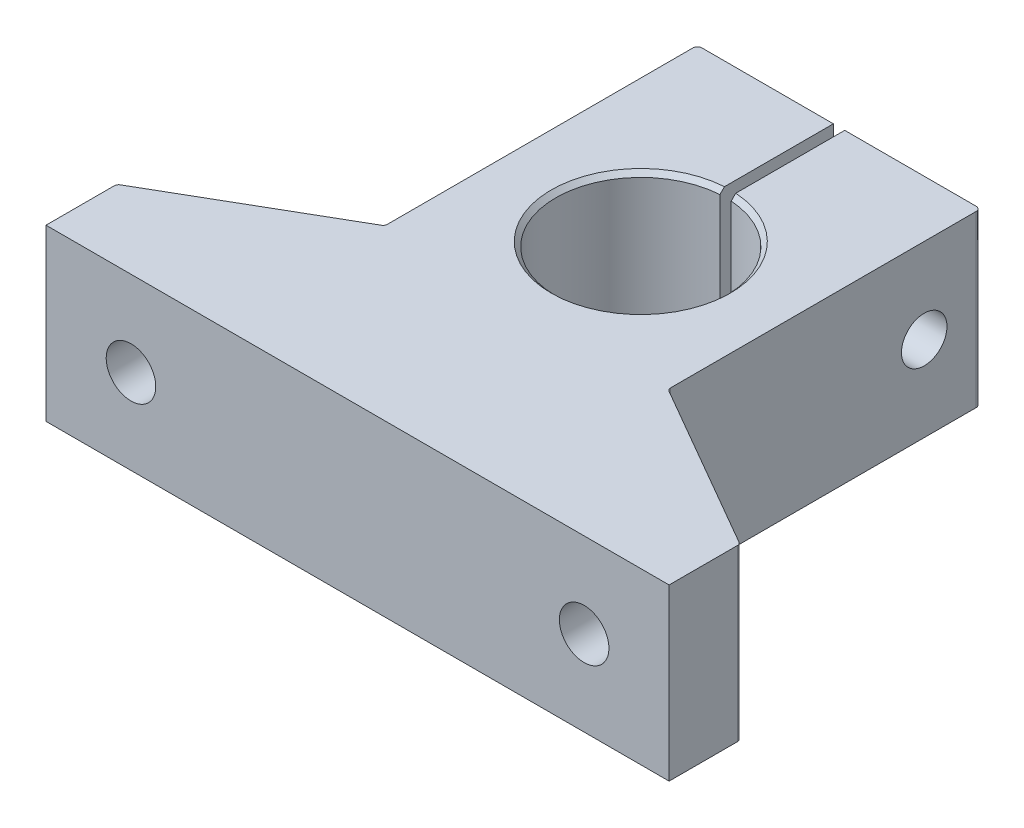
ISO-10303-21;
HEADER;
FILE_DESCRIPTION(('STEP AP214'),'2;1');
FILE_NAME('part.step','',(''),(''),'','','');
FILE_SCHEMA(('AUTOMOTIVE_DESIGN { 1 0 10303 214 1 1 1 1 }'));
ENDSEC;
DATA;
#1=APPLICATION_CONTEXT('core data for automotive mechanical design processes');
#2=APPLICATION_PROTOCOL_DEFINITION('international standard','automotive_design',2000,#1);
#3=PRODUCT_CONTEXT('',#1,'mechanical');
#4=PRODUCT('Part','Part','',(#3));
#5=PRODUCT_RELATED_PRODUCT_CATEGORY('part','',(#4));
#6=PRODUCT_DEFINITION_FORMATION('','',#4);
#7=PRODUCT_DEFINITION_CONTEXT('part definition',#1,'design');
#8=PRODUCT_DEFINITION('design','',#6,#7);
#9=PRODUCT_DEFINITION_SHAPE('','',#8);
#10=(LENGTH_UNIT() NAMED_UNIT(*) SI_UNIT(.MILLI.,.METRE.));
#11=(NAMED_UNIT(*) PLANE_ANGLE_UNIT() SI_UNIT($,.RADIAN.));
#12=(NAMED_UNIT(*) SI_UNIT($,.STERADIAN.) SOLID_ANGLE_UNIT());
#13=UNCERTAINTY_MEASURE_WITH_UNIT(LENGTH_MEASURE(1.E-05),#10,'distance_accuracy_value','');
#14=(GEOMETRIC_REPRESENTATION_CONTEXT(3) GLOBAL_UNCERTAINTY_ASSIGNED_CONTEXT((#13)) GLOBAL_UNIT_ASSIGNED_CONTEXT((#10,
#11,#12)) REPRESENTATION_CONTEXT('',''));
#15=CARTESIAN_POINT('',(0.,0.,0.));
#16=DIRECTION('',(0.,0.,1.));
#17=DIRECTION('',(1.,0.,0.));
#18=AXIS2_PLACEMENT_3D('',#15,#16,#17);
#19=CARTESIAN_POINT('',(34.925,19.05,-7.9375));
#20=DIRECTION('',(0.,0.,-1.));
#21=DIRECTION('',(-1.,0.,0.));
#22=AXIS2_PLACEMENT_3D('',#19,#20,#21);
#23=PLANE('',#22);
#24=CARTESIAN_POINT('',(25.4,9.525,-7.9375));
#25=DIRECTION('',(0.,0.,-1.));
#26=DIRECTION('',(-1.,0.,0.));
#27=AXIS2_PLACEMENT_3D('',#24,#25,#26);
#28=CIRCLE('',#27,4.7625);
#29=CARTESIAN_POINT('',(20.6375,9.525,-7.9375));
#30=VERTEX_POINT('',#29);
#31=EDGE_CURVE('E364',#30,#30,#28,.T.);
#32=ORIENTED_EDGE('',*,*,#31,.T.);
#33=EDGE_LOOP('',(#32));
#34=FACE_BOUND('',#33,.T.);
#35=CARTESIAN_POINT('',(25.4,9.525,-7.9375));
#36=DIRECTION('',(0.,0.,-1.));
#37=DIRECTION('',(-1.,0.,0.));
#38=AXIS2_PLACEMENT_3D('',#35,#36,#37);
#39=CIRCLE('',#38,2.77876);
#40=CARTESIAN_POINT('',(22.62124,9.525,-7.9375));
#41=VERTEX_POINT('',#40);
#42=EDGE_CURVE('E377',#41,#41,#39,.F.);
#43=ORIENTED_EDGE('',*,*,#42,.T.);
#44=EDGE_LOOP('',(#43));
#45=FACE_BOUND('',#44,.T.);
#46=ADVANCED_FACE('F18',(#34,#45),#23,.T.);
#47=CARTESIAN_POINT('',(34.925,19.05,-7.9375));
#48=DIRECTION('',(0.,0.,-1.));
#49=DIRECTION('',(-1.,0.,0.));
#50=AXIS2_PLACEMENT_3D('',#47,#48,#49);
#51=PLANE('',#50);
#52=CARTESIAN_POINT('',(-25.4,9.525,-7.93749999999999));
#53=DIRECTION('',(0.,0.,-1.));
#54=DIRECTION('',(-1.,0.,0.));
#55=AXIS2_PLACEMENT_3D('',#52,#53,#54);
#56=CIRCLE('',#55,4.7625);
#57=CARTESIAN_POINT('',(-30.1625,9.525,-7.93749999999999));
#58=VERTEX_POINT('',#57);
#59=EDGE_CURVE('E381',#58,#58,#56,.T.);
#60=ORIENTED_EDGE('',*,*,#59,.T.);
#61=EDGE_LOOP('',(#60));
#62=FACE_BOUND('',#61,.T.);
#63=CARTESIAN_POINT('',(-25.4,9.525,-7.93749999999999));
#64=DIRECTION('',(0.,0.,-1.));
#65=DIRECTION('',(-1.,0.,0.));
#66=AXIS2_PLACEMENT_3D('',#63,#64,#65);
#67=CIRCLE('',#66,2.77876);
#68=CARTESIAN_POINT('',(-28.17876,9.525,-7.93749999999999));
#69=VERTEX_POINT('',#68);
#70=EDGE_CURVE('E373',#69,#69,#67,.F.);
#71=ORIENTED_EDGE('',*,*,#70,.T.);
#72=EDGE_LOOP('',(#71));
#73=FACE_BOUND('',#72,.T.);
#74=ADVANCED_FACE('F219',(#62,#73),#51,.T.);
#75=CARTESIAN_POINT('',(-11.049,12.0777,-47.6453526164564));
#76=DIRECTION('',(1.,0.,0.));
#77=DIRECTION('',(0.,0.,-1.));
#78=AXIS2_PLACEMENT_3D('',#75,#76,#77);
#79=PLANE('',#78);
#80=CARTESIAN_POINT('',(-11.049,9.525,-47.6453526164564));
#81=DIRECTION('',(-1.,0.,0.));
#82=DIRECTION('',(0.,0.,1.));
#83=AXIS2_PLACEMENT_3D('',#80,#81,#82);
#84=CIRCLE('',#83,4.7625);
#85=CARTESIAN_POINT('',(-11.049,9.525,-42.8828526164564));
#86=VERTEX_POINT('',#85);
#87=EDGE_CURVE('E387',#86,#86,#84,.T.);
#88=ORIENTED_EDGE('',*,*,#87,.T.);
#89=EDGE_LOOP('',(#88));
#90=FACE_BOUND('',#89,.T.);
#91=CARTESIAN_POINT('',(-11.049,9.525,-47.6453526164564));
#92=DIRECTION('',(-1.,0.,0.));
#93=DIRECTION('',(0.,0.,1.));
#94=AXIS2_PLACEMENT_3D('',#91,#92,#93);
#95=CIRCLE('',#94,2.55269999999999);
#96=CARTESIAN_POINT('',(-11.049,9.525,-45.0926526164564));
#97=VERTEX_POINT('',#96);
#98=EDGE_CURVE('E112',#97,#97,#95,.F.);
#99=ORIENTED_EDGE('',*,*,#98,.T.);
#100=EDGE_LOOP('',(#99));
#101=FACE_BOUND('',#100,.T.);
#102=ADVANCED_FACE('F215',(#90,#101),#79,.F.);
#103=CARTESIAN_POINT('',(0.,19.05,-31.75));
#104=DIRECTION('',(0.,1.,0.));
#105=DIRECTION('',(-1.,0.,0.));
#106=AXIS2_PLACEMENT_3D('',#103,#104,#105);
#107=CONICAL_SURFACE('',#106,10.033,0.785398163397435);
#108=CARTESIAN_POINT('',(0.,18.542,-31.75));
#109=DIRECTION('',(0.,1.,0.));
#110=DIRECTION('',(0.,0.,1.));
#111=AXIS2_PLACEMENT_3D('',#108,#109,#110);
#112=CIRCLE('',#111,9.525);
#113=CARTESIAN_POINT('',(0.635000000000001,18.542,-41.2538097624058));
#114=VERTEX_POINT('',#113);
#115=CARTESIAN_POINT('',(-0.635,18.542,-41.2538097624058));
#116=VERTEX_POINT('',#115);
#117=EDGE_CURVE('E101',#114,#116,#112,.F.);
#118=ORIENTED_EDGE('',*,*,#117,.T.);
#119=CARTESIAN_POINT('',(-0.635000000000001,19.05,-41.7628848989689));
#120=CARTESIAN_POINT('',(-0.635,18.9653286642886,-41.6780437020624));
#121=CARTESIAN_POINT('',(-0.635,18.8806596631005,-41.593200175563));
#122=CARTESIAN_POINT('',(-0.635,18.7113263297671,-41.4235084633753));
#123=CARTESIAN_POINT('',(-0.635,18.626661997622,-41.3386602776869));
#124=CARTESIAN_POINT('',(-0.635,18.542,-41.2538097624058));
#125=B_SPLINE_CURVE_WITH_KNOTS('',3,(#119,#120,#121,#122,#123,#124),.UNSPECIFIED.,.F.,.F.,(4,2,
4),(0.,0.359590564057941,0.719181128130027),.UNSPECIFIED.);
#126=CARTESIAN_POINT('',(-0.635000000000001,19.05,-41.7628848989689));
#127=VERTEX_POINT('',#126);
#128=EDGE_CURVE('E21',#127,#116,#125,.T.);
#129=ORIENTED_EDGE('',*,*,#128,.F.);
#130=CARTESIAN_POINT('',(0.,19.05,-31.75));
#131=DIRECTION('',(0.,1.,0.));
#132=DIRECTION('',(-1.,0.,0.));
#133=AXIS2_PLACEMENT_3D('',#130,#131,#132);
#134=CIRCLE('',#133,10.033);
#135=CARTESIAN_POINT('',(0.635,19.05,-41.7628848989689));
#136=VERTEX_POINT('',#135);
#137=EDGE_CURVE('E94',#127,#136,#134,.T.);
#138=ORIENTED_EDGE('',*,*,#137,.T.);
#139=CARTESIAN_POINT('',(0.635000000000001,18.542,-41.2538097624058));
#140=CARTESIAN_POINT('',(0.635,18.626661997622,-41.3386602776869));
#141=CARTESIAN_POINT('',(0.635,18.7113263297671,-41.4235084633753));
#142=CARTESIAN_POINT('',(0.635,18.8806596631005,-41.593200175563));
#143=CARTESIAN_POINT('',(0.635,18.9653286642886,-41.6780437020624));
#144=CARTESIAN_POINT('',(0.635,19.05,-41.7628848989689));
#145=B_SPLINE_CURVE_WITH_KNOTS('',3,(#139,#140,#141,#142,#143,#144),.UNSPECIFIED.,.F.,.F.,(4,2,
4),(0.,0.359590564072086,0.719181128130027),.UNSPECIFIED.);
#146=EDGE_CURVE('E105',#114,#136,#145,.T.);
#147=ORIENTED_EDGE('',*,*,#146,.F.);
#148=EDGE_LOOP('',(#118,#129,#138,#147));
#149=FACE_BOUND('',#148,.T.);
#150=ADVANCED_FACE('F103',(#149),#107,.F.);
#151=CARTESIAN_POINT('',(-15.875,9.525,-47.6453526164564));
#152=DIRECTION('',(-1.,0.,0.));
#153=DIRECTION('',(0.,0.,1.));
#154=AXIS2_PLACEMENT_3D('',#151,#152,#153);
#155=CYLINDRICAL_SURFACE('',#154,2.55269999999999);
#156=CARTESIAN_POINT('',(-0.634999999999995,9.525,-47.6453526164564));
#157=DIRECTION('',(-1.,0.,0.));
#158=DIRECTION('',(0.,0.,1.));
#159=AXIS2_PLACEMENT_3D('',#156,#157,#158);
#160=CIRCLE('',#159,2.55269999999999);
#161=CARTESIAN_POINT('',(-0.634999999999995,9.525,-45.0926526164564));
#162=VERTEX_POINT('',#161);
#163=EDGE_CURVE('E134',#162,#162,#160,.F.);
#164=ORIENTED_EDGE('',*,*,#163,.T.);
#165=EDGE_LOOP('',(#164));
#166=FACE_BOUND('',#165,.T.);
#167=ORIENTED_EDGE('',*,*,#98,.F.);
#168=EDGE_LOOP('',(#167));
#169=FACE_BOUND('',#168,.T.);
#170=ADVANCED_FACE('F214',(#166,#169),#155,.F.);
#171=CARTESIAN_POINT('',(0.,0.,-31.75));
#172=DIRECTION('',(0.,1.,0.));
#173=DIRECTION('',(0.,0.,1.));
#174=AXIS2_PLACEMENT_3D('',#171,#172,#173);
#175=CYLINDRICAL_SURFACE('',#174,9.525);
#176=DIRECTION('',(0.,1.,0.));
#177=VECTOR('',#176,1.);
#178=CARTESIAN_POINT('',(0.635000000000012,0.,-41.2538097624058));
#179=LINE('',#178,#177);
#180=CARTESIAN_POINT('',(0.635000000000012,0.507999999999944,-41.2538097624058));
#181=VERTEX_POINT('',#180);
#182=EDGE_CURVE('E191',#114,#181,#179,.F.);
#183=ORIENTED_EDGE('',*,*,#182,.T.);
#184=CARTESIAN_POINT('',(0.,0.507999999999948,-31.75));
#185=DIRECTION('',(0.,-1.,0.));
#186=DIRECTION('',(0.,0.,-1.));
#187=AXIS2_PLACEMENT_3D('',#184,#185,#186);
#188=CIRCLE('',#187,9.525);
#189=CARTESIAN_POINT('',(-0.634999999999988,0.507999999999947,-41.2538097624058));
#190=VERTEX_POINT('',#189);
#191=EDGE_CURVE('E126',#181,#190,#188,.T.);
#192=ORIENTED_EDGE('',*,*,#191,.T.);
#193=DIRECTION('',(0.,-1.,0.));
#194=VECTOR('',#193,1.);
#195=CARTESIAN_POINT('',(-0.634999999999988,0.,-41.2538097624058));
#196=LINE('',#195,#194);
#197=EDGE_CURVE('E119',#190,#116,#196,.F.);
#198=ORIENTED_EDGE('',*,*,#197,.T.);
#199=ORIENTED_EDGE('',*,*,#117,.F.);
#200=EDGE_LOOP('',(#183,#192,#198,#199));
#201=FACE_BOUND('',#200,.T.);
#202=ADVANCED_FACE('F124',(#201),#175,.F.);
#203=CARTESIAN_POINT('',(-15.875,9.525,-47.6453526164564));
#204=DIRECTION('',(-1.,0.,0.));
#205=DIRECTION('',(0.,0.,1.));
#206=AXIS2_PLACEMENT_3D('',#203,#204,#205);
#207=CYLINDRICAL_SURFACE('',#206,2.55269999999999);
#208=CARTESIAN_POINT('',(15.875,9.525,-47.6453526164564));
#209=DIRECTION('',(-1.,0.,0.));
#210=DIRECTION('',(0.,0.,1.));
#211=AXIS2_PLACEMENT_3D('',#208,#209,#210);
#212=CIRCLE('',#211,2.55269999999999);
#213=CARTESIAN_POINT('',(15.875,9.525,-45.0926526164564));
#214=VERTEX_POINT('',#213);
#215=EDGE_CURVE('E175',#214,#214,#212,.F.);
#216=ORIENTED_EDGE('',*,*,#215,.T.);
#217=EDGE_LOOP('',(#216));
#218=FACE_BOUND('',#217,.T.);
#219=CARTESIAN_POINT('',(0.635000000000004,9.525,-47.6453526164564));
#220=DIRECTION('',(-1.,0.,0.));
#221=DIRECTION('',(0.,0.,1.));
#222=AXIS2_PLACEMENT_3D('',#219,#220,#221);
#223=CIRCLE('',#222,2.55269999999999);
#224=CARTESIAN_POINT('',(0.635000000000004,9.525,-45.0926526164564));
#225=VERTEX_POINT('',#224);
#226=EDGE_CURVE('E192',#225,#225,#223,.T.);
#227=ORIENTED_EDGE('',*,*,#226,.T.);
#228=EDGE_LOOP('',(#227));
#229=FACE_BOUND('',#228,.T.);
#230=ADVANCED_FACE('F277',(#218,#229),#207,.F.);
#231=CARTESIAN_POINT('',(15.367,19.05,-53.467));
#232=DIRECTION('',(0.,-1.,0.));
#233=DIRECTION('',(0.,0.,-1.));
#234=AXIS2_PLACEMENT_3D('',#231,#232,#233);
#235=CYLINDRICAL_SURFACE('',#234,0.507999999999995);
#236=CARTESIAN_POINT('',(15.367,19.05,-53.467));
#237=DIRECTION('',(0.,-1.,0.));
#238=DIRECTION('',(0.,0.,-1.));
#239=AXIS2_PLACEMENT_3D('',#236,#237,#238);
#240=CIRCLE('',#239,0.507999999999995);
#241=CARTESIAN_POINT('',(15.367,19.05,-53.975));
#242=VERTEX_POINT('',#241);
#243=CARTESIAN_POINT('',(15.875,19.05,-53.467));
#244=VERTEX_POINT('',#243);
#245=EDGE_CURVE('E396',#242,#244,#240,.T.);
#246=ORIENTED_EDGE('',*,*,#245,.T.);
#247=DIRECTION('',(0.,1.,0.));
#248=VECTOR('',#247,1.);
#249=CARTESIAN_POINT('',(15.875,19.05,-53.467));
#250=LINE('',#249,#248);
#251=CARTESIAN_POINT('',(15.875,0.,-53.467));
#252=VERTEX_POINT('',#251);
#253=EDGE_CURVE('E174',#244,#252,#250,.F.);
#254=ORIENTED_EDGE('',*,*,#253,.T.);
#255=CARTESIAN_POINT('',(15.367,0.,-53.467));
#256=DIRECTION('',(0.,-1.,0.));
#257=DIRECTION('',(0.,0.,-1.));
#258=AXIS2_PLACEMENT_3D('',#255,#256,#257);
#259=CIRCLE('',#258,0.507999999999995);
#260=CARTESIAN_POINT('',(15.367,0.,-53.975));
#261=VERTEX_POINT('',#260);
#262=EDGE_CURVE('E111',#252,#261,#259,.F.);
#263=ORIENTED_EDGE('',*,*,#262,.T.);
#264=DIRECTION('',(0.,1.,0.));
#265=VECTOR('',#264,1.);
#266=CARTESIAN_POINT('',(15.367,19.05,-53.975));
#267=LINE('',#266,#265);
#268=EDGE_CURVE('E431',#261,#242,#267,.T.);
#269=ORIENTED_EDGE('',*,*,#268,.T.);
#270=EDGE_LOOP('',(#246,#254,#263,#269));
#271=FACE_BOUND('',#270,.T.);
#272=ADVANCED_FACE('F280',(#271),#235,.T.);
#273=CARTESIAN_POINT('',(25.4,9.525,13.4703841816037));
#274=DIRECTION('',(0.,0.,-1.));
#275=DIRECTION('',(-1.,0.,0.));
#276=AXIS2_PLACEMENT_3D('',#273,#274,#275);
#277=CYLINDRICAL_SURFACE('',#276,4.7625);
#278=CARTESIAN_POINT('',(25.4,9.525,-13.4367613140311));
#279=DIRECTION('',(-0.499999999999994,0.,0.866025403784442));
#280=DIRECTION('',(-0.866025403784442,0.,-0.499999999999994));
#281=AXIS2_PLACEMENT_3D('',#278,#279,#280);
#282=ELLIPSE('',#281,5.49926131403116,4.7625);
#283=CARTESIAN_POINT('',(20.6375,9.525,-16.1863919710466));
#284=VERTEX_POINT('',#283);
#285=EDGE_CURVE('E169',#284,#284,#282,.F.);
#286=ORIENTED_EDGE('',*,*,#285,.T.);
#287=EDGE_LOOP('',(#286));
#288=FACE_BOUND('',#287,.T.);
#289=ORIENTED_EDGE('',*,*,#31,.F.);
#290=EDGE_LOOP('',(#289));
#291=FACE_BOUND('',#290,.T.);
#292=ADVANCED_FACE('F339',(#288,#291),#277,.F.);
#293=CARTESIAN_POINT('',(16.383,19.05,-19.2293165648105));
#294=DIRECTION('',(0.,-1.,0.));
#295=DIRECTION('',(0.,0.,-1.));
#296=AXIS2_PLACEMENT_3D('',#293,#294,#295);
#297=CYLINDRICAL_SURFACE('',#296,0.508000000000002);
#298=DIRECTION('',(0.,1.,0.));
#299=VECTOR('',#298,1.);
#300=CARTESIAN_POINT('',(15.875,19.05,-19.2293165648105));
#301=LINE('',#300,#299);
#302=CARTESIAN_POINT('',(15.875,0.,-19.2293165648105));
#303=VERTEX_POINT('',#302);
#304=CARTESIAN_POINT('',(15.875,19.05,-19.2293165648105));
#305=VERTEX_POINT('',#304);
#306=EDGE_CURVE('E179',#303,#305,#301,.T.);
#307=ORIENTED_EDGE('',*,*,#306,.T.);
#308=CARTESIAN_POINT('',(16.383,19.05,-19.2293165648105));
#309=DIRECTION('',(0.,-1.,0.));
#310=DIRECTION('',(0.,0.,-1.));
#311=AXIS2_PLACEMENT_3D('',#308,#309,#310);
#312=CIRCLE('',#311,0.508000000000002);
#313=CARTESIAN_POINT('',(16.129,19.05,-18.789375659688));
#314=VERTEX_POINT('',#313);
#315=EDGE_CURVE('E400',#305,#314,#312,.F.);
#316=ORIENTED_EDGE('',*,*,#315,.T.);
#317=DIRECTION('',(0.,1.,0.));
#318=VECTOR('',#317,1.);
#319=CARTESIAN_POINT('',(16.129,19.05,-18.789375659688));
#320=LINE('',#319,#318);
#321=CARTESIAN_POINT('',(16.129,0.,-18.789375659688));
#322=VERTEX_POINT('',#321);
#323=EDGE_CURVE('E488',#314,#322,#320,.F.);
#324=ORIENTED_EDGE('',*,*,#323,.T.);
#325=CARTESIAN_POINT('',(16.383,0.,-19.2293165648105));
#326=DIRECTION('',(0.,-1.,0.));
#327=DIRECTION('',(0.,0.,-1.));
#328=AXIS2_PLACEMENT_3D('',#325,#326,#327);
#329=CIRCLE('',#328,0.508000000000002);
#330=EDGE_CURVE('E367',#303,#322,#329,.F.);
#331=ORIENTED_EDGE('',*,*,#330,.F.);
#332=EDGE_LOOP('',(#307,#316,#324,#331));
#333=FACE_BOUND('',#332,.T.);
#334=ADVANCED_FACE('F335',(#333),#297,.F.);
#335=CARTESIAN_POINT('',(34.417,19.05,-7.64420606325167));
#336=DIRECTION('',(0.,-1.,0.));
#337=DIRECTION('',(0.,0.,-1.));
#338=AXIS2_PLACEMENT_3D('',#335,#336,#337);
#339=CYLINDRICAL_SURFACE('',#338,0.508000000000005);
#340=CARTESIAN_POINT('',(34.417,19.05,-7.64420606325167));
#341=DIRECTION('',(0.,-1.,0.));
#342=DIRECTION('',(0.,0.,-1.));
#343=AXIS2_PLACEMENT_3D('',#340,#341,#342);
#344=CIRCLE('',#343,0.508000000000005);
#345=CARTESIAN_POINT('',(34.671,19.05,-8.08414696837417));
#346=VERTEX_POINT('',#345);
#347=CARTESIAN_POINT('',(34.925,19.05,-7.64420606325167));
#348=VERTEX_POINT('',#347);
#349=EDGE_CURVE('E404',#346,#348,#344,.T.);
#350=ORIENTED_EDGE('',*,*,#349,.T.);
#351=DIRECTION('',(0.,1.,0.));
#352=VECTOR('',#351,1.);
#353=CARTESIAN_POINT('',(34.925,19.05,-7.64420606325167));
#354=LINE('',#353,#352);
#355=CARTESIAN_POINT('',(34.925,0.,-7.64420606325167));
#356=VERTEX_POINT('',#355);
#357=EDGE_CURVE('E168',#348,#356,#354,.F.);
#358=ORIENTED_EDGE('',*,*,#357,.T.);
#359=CARTESIAN_POINT('',(34.417,0.,-7.64420606325167));
#360=DIRECTION('',(0.,-1.,0.));
#361=DIRECTION('',(0.,0.,-1.));
#362=AXIS2_PLACEMENT_3D('',#359,#360,#361);
#363=CIRCLE('',#362,0.508000000000005);
#364=CARTESIAN_POINT('',(34.671,0.,-8.08414696837417));
#365=VERTEX_POINT('',#364);
#366=EDGE_CURVE('E370',#356,#365,#363,.F.);
#367=ORIENTED_EDGE('',*,*,#366,.T.);
#368=DIRECTION('',(0.,1.,0.));
#369=VECTOR('',#368,1.);
#370=CARTESIAN_POINT('',(34.671,19.05,-8.08414696837417));
#371=LINE('',#370,#369);
#372=EDGE_CURVE('E173',#365,#346,#371,.T.);
#373=ORIENTED_EDGE('',*,*,#372,.T.);
#374=EDGE_LOOP('',(#350,#358,#367,#373));
#375=FACE_BOUND('',#374,.T.);
#376=ADVANCED_FACE('F331',(#375),#339,.T.);
#377=CARTESIAN_POINT('',(-25.4,9.525,0.));
#378=DIRECTION('',(0.,0.,-1.));
#379=DIRECTION('',(-1.,0.,0.));
#380=AXIS2_PLACEMENT_3D('',#377,#378,#379);
#381=CYLINDRICAL_SURFACE('',#380,2.77876);
#382=CARTESIAN_POINT('',(-25.4,9.525,0.));
#383=DIRECTION('',(0.,0.,-1.));
#384=DIRECTION('',(-1.,0.,0.));
#385=AXIS2_PLACEMENT_3D('',#382,#383,#384);
#386=CIRCLE('',#385,2.77876);
#387=CARTESIAN_POINT('',(-28.17876,9.525,0.));
#388=VERTEX_POINT('',#387);
#389=EDGE_CURVE('E164',#388,#388,#386,.F.);
#390=ORIENTED_EDGE('',*,*,#389,.T.);
#391=EDGE_LOOP('',(#390));
#392=FACE_BOUND('',#391,.T.);
#393=ORIENTED_EDGE('',*,*,#70,.F.);
#394=EDGE_LOOP('',(#393));
#395=FACE_BOUND('',#394,.T.);
#396=ADVANCED_FACE('F327',(#392,#395),#381,.F.);
#397=CARTESIAN_POINT('',(25.4,9.525,0.));
#398=DIRECTION('',(0.,0.,-1.));
#399=DIRECTION('',(-1.,0.,0.));
#400=AXIS2_PLACEMENT_3D('',#397,#398,#399);
#401=CYLINDRICAL_SURFACE('',#400,2.77876);
#402=CARTESIAN_POINT('',(25.4,9.525,0.));
#403=DIRECTION('',(0.,0.,-1.));
#404=DIRECTION('',(-1.,0.,0.));
#405=AXIS2_PLACEMENT_3D('',#402,#403,#404);
#406=CIRCLE('',#405,2.77876);
#407=CARTESIAN_POINT('',(22.62124,9.525,0.));
#408=VERTEX_POINT('',#407);
#409=EDGE_CURVE('E159',#408,#408,#406,.F.);
#410=ORIENTED_EDGE('',*,*,#409,.T.);
#411=EDGE_LOOP('',(#410));
#412=FACE_BOUND('',#411,.T.);
#413=ORIENTED_EDGE('',*,*,#42,.F.);
#414=EDGE_LOOP('',(#413));
#415=FACE_BOUND('',#414,.T.);
#416=ADVANCED_FACE('F323',(#412,#415),#401,.F.);
#417=CARTESIAN_POINT('',(-25.4,9.525,13.4703841816037));
#418=DIRECTION('',(0.,0.,-1.));
#419=DIRECTION('',(-1.,0.,0.));
#420=AXIS2_PLACEMENT_3D('',#417,#418,#419);
#421=CYLINDRICAL_SURFACE('',#420,4.7625);
#422=CARTESIAN_POINT('',(-25.4,9.525,-13.4367613140312));
#423=DIRECTION('',(0.500000000000001,0.,0.866025403784438));
#424=DIRECTION('',(0.866025403784438,0.,-0.500000000000001));
#425=AXIS2_PLACEMENT_3D('',#422,#423,#424);
#426=ELLIPSE('',#425,5.49926131403119,4.7625);
#427=CARTESIAN_POINT('',(-20.6375,9.525,-16.1863919710468));
#428=VERTEX_POINT('',#427);
#429=EDGE_CURVE('E153',#428,#428,#426,.F.);
#430=ORIENTED_EDGE('',*,*,#429,.T.);
#431=EDGE_LOOP('',(#430));
#432=FACE_BOUND('',#431,.T.);
#433=ORIENTED_EDGE('',*,*,#59,.F.);
#434=EDGE_LOOP('',(#433));
#435=FACE_BOUND('',#434,.T.);
#436=ADVANCED_FACE('F319',(#432,#435),#421,.F.);
#437=CARTESIAN_POINT('',(-34.417,19.05,-7.64420606325166));
#438=DIRECTION('',(0.,-1.,0.));
#439=DIRECTION('',(0.,0.,-1.));
#440=AXIS2_PLACEMENT_3D('',#437,#438,#439);
#441=CYLINDRICAL_SURFACE('',#440,0.507999999999993);
#442=CARTESIAN_POINT('',(-34.417,19.05,-7.64420606325166));
#443=DIRECTION('',(0.,-1.,0.));
#444=DIRECTION('',(0.,0.,-1.));
#445=AXIS2_PLACEMENT_3D('',#442,#443,#444);
#446=CIRCLE('',#445,0.507999999999993);
#447=CARTESIAN_POINT('',(-34.925,19.05,-7.64420606325166));
#448=VERTEX_POINT('',#447);
#449=CARTESIAN_POINT('',(-34.671,19.05,-8.08414696837416));
#450=VERTEX_POINT('',#449);
#451=EDGE_CURVE('E408',#448,#450,#446,.T.);
#452=ORIENTED_EDGE('',*,*,#451,.T.);
#453=DIRECTION('',(0.,1.,0.));
#454=VECTOR('',#453,1.);
#455=CARTESIAN_POINT('',(-34.671,19.05,-8.08414696837416));
#456=LINE('',#455,#454);
#457=CARTESIAN_POINT('',(-34.671,0.,-8.08414696837415));
#458=VERTEX_POINT('',#457);
#459=EDGE_CURVE('E152',#450,#458,#456,.F.);
#460=ORIENTED_EDGE('',*,*,#459,.T.);
#461=CARTESIAN_POINT('',(-34.417,0.,-7.64420606325166));
#462=DIRECTION('',(0.,-1.,0.));
#463=DIRECTION('',(0.,0.,-1.));
#464=AXIS2_PLACEMENT_3D('',#461,#462,#463);
#465=CIRCLE('',#464,0.507999999999993);
#466=CARTESIAN_POINT('',(-34.925,0.,-7.64420606325166));
#467=VERTEX_POINT('',#466);
#468=EDGE_CURVE('E384',#458,#467,#465,.F.);
#469=ORIENTED_EDGE('',*,*,#468,.T.);
#470=DIRECTION('',(0.,1.,0.));
#471=VECTOR('',#470,1.);
#472=CARTESIAN_POINT('',(-34.925,19.05,-7.64420606325166));
#473=LINE('',#472,#471);
#474=EDGE_CURVE('E481',#467,#448,#473,.T.);
#475=ORIENTED_EDGE('',*,*,#474,.T.);
#476=EDGE_LOOP('',(#452,#460,#469,#475));
#477=FACE_BOUND('',#476,.T.);
#478=ADVANCED_FACE('F315',(#477),#441,.T.);
#479=CARTESIAN_POINT('',(-15.875,9.525,-47.6453526164564));
#480=DIRECTION('',(-1.,0.,0.));
#481=DIRECTION('',(0.,0.,1.));
#482=AXIS2_PLACEMENT_3D('',#479,#480,#481);
#483=CYLINDRICAL_SURFACE('',#482,4.7625);
#484=ORIENTED_EDGE('',*,*,#87,.F.);
#485=EDGE_LOOP('',(#484));
#486=FACE_BOUND('',#485,.T.);
#487=CARTESIAN_POINT('',(-15.875,9.525,-47.6453526164564));
#488=DIRECTION('',(-1.,0.,0.));
#489=DIRECTION('',(0.,0.,1.));
#490=AXIS2_PLACEMENT_3D('',#487,#488,#489);
#491=CIRCLE('',#490,4.7625);
#492=CARTESIAN_POINT('',(-15.875,9.525,-42.8828526164564));
#493=VERTEX_POINT('',#492);
#494=EDGE_CURVE('E147',#493,#493,#491,.T.);
#495=ORIENTED_EDGE('',*,*,#494,.T.);
#496=EDGE_LOOP('',(#495));
#497=FACE_BOUND('',#496,.T.);
#498=ADVANCED_FACE('F311',(#486,#497),#483,.F.);
#499=CARTESIAN_POINT('',(-16.383,19.05,-19.2293165648107));
#500=DIRECTION('',(0.,-1.,0.));
#501=DIRECTION('',(0.,0.,-1.));
#502=AXIS2_PLACEMENT_3D('',#499,#500,#501);
#503=CYLINDRICAL_SURFACE('',#502,0.508000000000002);
#504=DIRECTION('',(0.,1.,0.));
#505=VECTOR('',#504,1.);
#506=CARTESIAN_POINT('',(-16.129,19.05,-18.7893756596882));
#507=LINE('',#506,#505);
#508=CARTESIAN_POINT('',(-16.129,0.,-18.7893756596882));
#509=VERTEX_POINT('',#508);
#510=CARTESIAN_POINT('',(-16.129,19.05,-18.7893756596882));
#511=VERTEX_POINT('',#510);
#512=EDGE_CURVE('E157',#509,#511,#507,.T.);
#513=ORIENTED_EDGE('',*,*,#512,.T.);
#514=CARTESIAN_POINT('',(-16.383,19.05,-19.2293165648107));
#515=DIRECTION('',(0.,-1.,0.));
#516=DIRECTION('',(0.,0.,-1.));
#517=AXIS2_PLACEMENT_3D('',#514,#515,#516);
#518=CIRCLE('',#517,0.508000000000002);
#519=CARTESIAN_POINT('',(-15.875,19.05,-19.2293165648107));
#520=VERTEX_POINT('',#519);
#521=EDGE_CURVE('E412',#511,#520,#518,.F.);
#522=ORIENTED_EDGE('',*,*,#521,.T.);
#523=DIRECTION('',(0.,1.,0.));
#524=VECTOR('',#523,1.);
#525=CARTESIAN_POINT('',(-15.875,19.05,-19.2293165648107));
#526=LINE('',#525,#524);
#527=CARTESIAN_POINT('',(-15.875,0.,-19.2293165648107));
#528=VERTEX_POINT('',#527);
#529=EDGE_CURVE('E466',#520,#528,#526,.F.);
#530=ORIENTED_EDGE('',*,*,#529,.T.);
#531=CARTESIAN_POINT('',(-16.383,0.,-19.2293165648107));
#532=DIRECTION('',(0.,-1.,0.));
#533=DIRECTION('',(0.,0.,-1.));
#534=AXIS2_PLACEMENT_3D('',#531,#532,#533);
#535=CIRCLE('',#534,0.508000000000002);
#536=EDGE_CURVE('E391',#509,#528,#535,.F.);
#537=ORIENTED_EDGE('',*,*,#536,.F.);
#538=EDGE_LOOP('',(#513,#522,#530,#537));
#539=FACE_BOUND('',#538,.T.);
#540=ADVANCED_FACE('F307',(#539),#503,.F.);
#541=CARTESIAN_POINT('',(-15.367,19.05,-53.467));
#542=DIRECTION('',(0.,-1.,0.));
#543=DIRECTION('',(0.,0.,-1.));
#544=AXIS2_PLACEMENT_3D('',#541,#542,#543);
#545=CYLINDRICAL_SURFACE('',#544,0.508000000000002);
#546=CARTESIAN_POINT('',(-15.367,19.05,-53.467));
#547=DIRECTION('',(0.,-1.,0.));
#548=DIRECTION('',(0.,0.,-1.));
#549=AXIS2_PLACEMENT_3D('',#546,#547,#548);
#550=CIRCLE('',#549,0.508000000000002);
#551=CARTESIAN_POINT('',(-15.875,19.05,-53.467));
#552=VERTEX_POINT('',#551);
#553=CARTESIAN_POINT('',(-15.367,19.05,-53.975));
#554=VERTEX_POINT('',#553);
#555=EDGE_CURVE('E416',#552,#554,#550,.T.);
#556=ORIENTED_EDGE('',*,*,#555,.T.);
#557=DIRECTION('',(0.,1.,0.));
#558=VECTOR('',#557,1.);
#559=CARTESIAN_POINT('',(-15.367,19.05,-53.975));
#560=LINE('',#559,#558);
#561=CARTESIAN_POINT('',(-15.367,0.,-53.975));
#562=VERTEX_POINT('',#561);
#563=EDGE_CURVE('E626',#554,#562,#560,.F.);
#564=ORIENTED_EDGE('',*,*,#563,.T.);
#565=CARTESIAN_POINT('',(-15.367,0.,-53.467));
#566=DIRECTION('',(0.,-1.,0.));
#567=DIRECTION('',(0.,0.,-1.));
#568=AXIS2_PLACEMENT_3D('',#565,#566,#567);
#569=CIRCLE('',#568,0.508000000000002);
#570=CARTESIAN_POINT('',(-15.875,0.,-53.467));
#571=VERTEX_POINT('',#570);
#572=EDGE_CURVE('E41',#562,#571,#569,.F.);
#573=ORIENTED_EDGE('',*,*,#572,.T.);
#574=DIRECTION('',(0.,1.,0.));
#575=VECTOR('',#574,1.);
#576=CARTESIAN_POINT('',(-15.875,19.05,-53.467));
#577=LINE('',#576,#575);
#578=EDGE_CURVE('E151',#571,#552,#577,.T.);
#579=ORIENTED_EDGE('',*,*,#578,.T.);
#580=EDGE_LOOP('',(#556,#564,#573,#579));
#581=FACE_BOUND('',#580,.T.);
#582=ADVANCED_FACE('F304',(#581),#545,.T.);
#583=CARTESIAN_POINT('',(-34.417,19.05,-7.64420606325166));
#584=DIRECTION('',(0.,-1.,0.));
#585=DIRECTION('',(0.,0.,-1.));
#586=AXIS2_PLACEMENT_3D('',#583,#584,#585);
#587=PLANE('',#586);
#588=ORIENTED_EDGE('',*,*,#137,.F.);
#589=DIRECTION('',(0.,0.,1.));
#590=VECTOR('',#589,1.);
#591=CARTESIAN_POINT('',(-0.635000000000001,19.05,0.00100000000000794));
#592=LINE('',#591,#590);
#593=CARTESIAN_POINT('',(-0.634999999999994,19.05,-53.975));
#594=VERTEX_POINT('',#593);
#595=EDGE_CURVE('E122',#127,#594,#592,.F.);
#596=ORIENTED_EDGE('',*,*,#595,.T.);
#597=DIRECTION('',(1.,0.,0.));
#598=VECTOR('',#597,1.);
#599=CARTESIAN_POINT('',(-15.367,19.05,-53.975));
#600=LINE('',#599,#598);
#601=EDGE_CURVE('E453',#594,#554,#600,.F.);
#602=ORIENTED_EDGE('',*,*,#601,.T.);
#603=ORIENTED_EDGE('',*,*,#555,.F.);
#604=DIRECTION('',(0.,0.,-1.));
#605=VECTOR('',#604,1.);
#606=CARTESIAN_POINT('',(-15.875,19.05,-19.2293165648107));
#607=LINE('',#606,#605);
#608=EDGE_CURVE('E462',#552,#520,#607,.F.);
#609=ORIENTED_EDGE('',*,*,#608,.T.);
#610=ORIENTED_EDGE('',*,*,#521,.F.);
#611=DIRECTION('',(0.866025403784438,0.,-0.500000000000001));
#612=VECTOR('',#611,1.);
#613=CARTESIAN_POINT('',(-16.129,19.05,-18.7893756596882));
#614=LINE('',#613,#612);
#615=EDGE_CURVE('E467',#511,#450,#614,.F.);
#616=ORIENTED_EDGE('',*,*,#615,.T.);
#617=ORIENTED_EDGE('',*,*,#451,.F.);
#618=DIRECTION('',(0.,0.,-1.));
#619=VECTOR('',#618,1.);
#620=CARTESIAN_POINT('',(-34.925,19.05,0.));
#621=LINE('',#620,#619);
#622=CARTESIAN_POINT('',(-34.925,19.05,0.));
#623=VERTEX_POINT('',#622);
#624=EDGE_CURVE('E477',#448,#623,#621,.F.);
#625=ORIENTED_EDGE('',*,*,#624,.T.);
#626=DIRECTION('',(-1.,0.,0.));
#627=VECTOR('',#626,1.);
#628=CARTESIAN_POINT('',(34.925,19.05,0.));
#629=LINE('',#628,#627);
#630=CARTESIAN_POINT('',(34.925,19.05,0.));
#631=VERTEX_POINT('',#630);
#632=EDGE_CURVE('E163',#623,#631,#629,.F.);
#633=ORIENTED_EDGE('',*,*,#632,.T.);
#634=DIRECTION('',(0.,0.,1.));
#635=VECTOR('',#634,1.);
#636=CARTESIAN_POINT('',(34.925,19.05,-7.64420606325167));
#637=LINE('',#636,#635);
#638=EDGE_CURVE('E484',#631,#348,#637,.F.);
#639=ORIENTED_EDGE('',*,*,#638,.T.);
#640=ORIENTED_EDGE('',*,*,#349,.F.);
#641=DIRECTION('',(0.866025403784442,0.,0.499999999999994));
#642=VECTOR('',#641,1.);
#643=CARTESIAN_POINT('',(16.129,19.05,-18.789375659688));
#644=LINE('',#643,#642);
#645=EDGE_CURVE('E490',#346,#314,#644,.F.);
#646=ORIENTED_EDGE('',*,*,#645,.T.);
#647=ORIENTED_EDGE('',*,*,#315,.F.);
#648=DIRECTION('',(0.,0.,1.));
#649=VECTOR('',#648,1.);
#650=CARTESIAN_POINT('',(15.875,19.05,-53.467));
#651=LINE('',#650,#649);
#652=EDGE_CURVE('E438',#305,#244,#651,.F.);
#653=ORIENTED_EDGE('',*,*,#652,.T.);
#654=ORIENTED_EDGE('',*,*,#245,.F.);
#655=DIRECTION('',(1.,0.,0.));
#656=VECTOR('',#655,1.);
#657=CARTESIAN_POINT('',(-15.367,19.05,-53.975));
#658=LINE('',#657,#656);
#659=CARTESIAN_POINT('',(0.635000000000001,19.05,-53.975));
#660=VERTEX_POINT('',#659);
#661=EDGE_CURVE('E427',#242,#660,#658,.F.);
#662=ORIENTED_EDGE('',*,*,#661,.T.);
#663=DIRECTION('',(0.,0.,1.));
#664=VECTOR('',#663,1.);
#665=CARTESIAN_POINT('',(0.635,19.05,0.00100000000000794));
#666=LINE('',#665,#664);
#667=EDGE_CURVE('E190',#660,#136,#666,.T.);
#668=ORIENTED_EDGE('',*,*,#667,.T.);
#669=EDGE_LOOP('',(#588,#596,#602,#603,#609,#610,#616,#617,#625,#633,#639,#640,#646,#647,#653,
#654,#662,#668));
#670=FACE_BOUND('',#669,.T.);
#671=ADVANCED_FACE('F300',(#670),#587,.F.);
#672=CARTESIAN_POINT('',(-0.634999999999988,0.,0.00100000000000794));
#673=DIRECTION('',(-1.,0.,0.));
#674=DIRECTION('',(0.,-1.,0.));
#675=AXIS2_PLACEMENT_3D('',#672,#673,#674);
#676=PLANE('',#675);
#677=CARTESIAN_POINT('',(-0.634999999999988,0.507999999999946,-41.2538097624058));
#678=CARTESIAN_POINT('',(-0.634999999999988,0.423338002377978,-41.3386602776869));
#679=CARTESIAN_POINT('',(-0.634999999999988,0.338673670232833,-41.4235084633752));
#680=CARTESIAN_POINT('',(-0.634999999999988,0.169340336899518,-41.5932001755629));
#681=CARTESIAN_POINT('',(-0.634999999999988,0.0846713357113488,-41.6780437020623));
#682=CARTESIAN_POINT('',(-0.634999999999988,0.,-41.7628848989689));
#683=B_SPLINE_CURVE_WITH_KNOTS('',3,(#677,#678,#679,#680,#681,#682),.UNSPECIFIED.,.F.,.F.,(4,2,
4),(0.,0.359590564072029,0.719181128129915),.UNSPECIFIED.);
#684=CARTESIAN_POINT('',(-0.634999999999989,0.,-41.7628848989689));
#685=VERTEX_POINT('',#684);
#686=EDGE_CURVE('E132',#190,#685,#683,.T.);
#687=ORIENTED_EDGE('',*,*,#686,.T.);
#688=DIRECTION('',(0.,0.,-1.));
#689=VECTOR('',#688,1.);
#690=CARTESIAN_POINT('',(-0.63499999999999,0.,-7.64420606325166));
#691=LINE('',#690,#689);
#692=CARTESIAN_POINT('',(-0.634999999999989,0.,-53.975));
#693=VERTEX_POINT('',#692);
#694=EDGE_CURVE('E146',#693,#685,#691,.F.);
#695=ORIENTED_EDGE('',*,*,#694,.F.);
#696=DIRECTION('',(0.,1.,0.));
#697=VECTOR('',#696,1.);
#698=CARTESIAN_POINT('',(-0.634999999999988,19.05,-53.975));
#699=LINE('',#698,#697);
#700=EDGE_CURVE('E457',#693,#594,#699,.T.);
#701=ORIENTED_EDGE('',*,*,#700,.T.);
#702=ORIENTED_EDGE('',*,*,#595,.F.);
#703=ORIENTED_EDGE('',*,*,#128,.T.);
#704=ORIENTED_EDGE('',*,*,#197,.F.);
#705=EDGE_LOOP('',(#687,#695,#701,#702,#703,#704));
#706=FACE_BOUND('',#705,.T.);
#707=ORIENTED_EDGE('',*,*,#163,.F.);
#708=EDGE_LOOP('',(#707));
#709=FACE_BOUND('',#708,.T.);
#710=ADVANCED_FACE('F117',(#706,#709),#676,.F.);
#711=CARTESIAN_POINT('',(0.,0.,-31.75));
#712=DIRECTION('',(0.,-1.,0.));
#713=DIRECTION('',(0.,0.,-1.));
#714=AXIS2_PLACEMENT_3D('',#711,#712,#713);
#715=CONICAL_SURFACE('',#714,10.033,0.785398163397452);
#716=ORIENTED_EDGE('',*,*,#191,.F.);
#717=CARTESIAN_POINT('',(0.635000000000012,0.507999999999945,-41.2538097624058));
#718=CARTESIAN_POINT('',(0.635000000000012,0.423338002377976,-41.3386602776869));
#719=CARTESIAN_POINT('',(0.635000000000012,0.338673670232831,-41.4235084633752));
#720=CARTESIAN_POINT('',(0.635000000000012,0.169340336899515,-41.5932001755629));
#721=CARTESIAN_POINT('',(0.635000000000012,0.0846713357113457,-41.6780437020623));
#722=CARTESIAN_POINT('',(0.635000000000012,0.,-41.7628848989689));
#723=B_SPLINE_CURVE_WITH_KNOTS('',3,(#717,#718,#719,#720,#721,#722),.UNSPECIFIED.,.F.,.F.,(4,2,
4),(0.,0.35959056407203,0.719181128129917),.UNSPECIFIED.);
#724=CARTESIAN_POINT('',(0.635000000000011,0.,-41.7628848989689));
#725=VERTEX_POINT('',#724);
#726=EDGE_CURVE('E181',#181,#725,#723,.T.);
#727=ORIENTED_EDGE('',*,*,#726,.T.);
#728=CARTESIAN_POINT('',(0.,0.,-31.75));
#729=DIRECTION('',(0.,-1.,0.));
#730=DIRECTION('',(0.,0.,-1.));
#731=AXIS2_PLACEMENT_3D('',#728,#729,#730);
#732=CIRCLE('',#731,10.0329999999999);
#733=EDGE_CURVE('E141',#685,#725,#732,.F.);
#734=ORIENTED_EDGE('',*,*,#733,.F.);
#735=ORIENTED_EDGE('',*,*,#686,.F.);
#736=EDGE_LOOP('',(#716,#727,#734,#735));
#737=FACE_BOUND('',#736,.T.);
#738=ADVANCED_FACE('F194',(#737),#715,.F.);
#739=CARTESIAN_POINT('',(0.635000000000012,0.,0.00100000000000794));
#740=DIRECTION('',(1.,0.,0.));
#741=DIRECTION('',(0.,1.,0.));
#742=AXIS2_PLACEMENT_3D('',#739,#740,#741);
#743=PLANE('',#742);
#744=DIRECTION('',(0.,1.,0.));
#745=VECTOR('',#744,1.);
#746=CARTESIAN_POINT('',(0.635000000000002,19.05,-53.975));
#747=LINE('',#746,#745);
#748=CARTESIAN_POINT('',(0.635000000000008,0.,-53.975));
#749=VERTEX_POINT('',#748);
#750=EDGE_CURVE('E180',#660,#749,#747,.F.);
#751=ORIENTED_EDGE('',*,*,#750,.T.);
#752=DIRECTION('',(0.,0.,-1.));
#753=VECTOR('',#752,1.);
#754=CARTESIAN_POINT('',(0.635000000000011,0.,-7.64420606325166));
#755=LINE('',#754,#753);
#756=EDGE_CURVE('E145',#725,#749,#755,.T.);
#757=ORIENTED_EDGE('',*,*,#756,.F.);
#758=ORIENTED_EDGE('',*,*,#726,.F.);
#759=ORIENTED_EDGE('',*,*,#182,.F.);
#760=ORIENTED_EDGE('',*,*,#146,.T.);
#761=ORIENTED_EDGE('',*,*,#667,.F.);
#762=EDGE_LOOP('',(#751,#757,#758,#759,#760,#761));
#763=FACE_BOUND('',#762,.T.);
#764=ORIENTED_EDGE('',*,*,#226,.F.);
#765=EDGE_LOOP('',(#764));
#766=FACE_BOUND('',#765,.T.);
#767=ADVANCED_FACE('F196',(#763,#766),#743,.F.);
#768=CARTESIAN_POINT('',(-15.367,19.05,-53.975));
#769=DIRECTION('',(0.,0.,1.));
#770=DIRECTION('',(1.,0.,0.));
#771=AXIS2_PLACEMENT_3D('',#768,#769,#770);
#772=PLANE('',#771);
#773=ORIENTED_EDGE('',*,*,#750,.F.);
#774=ORIENTED_EDGE('',*,*,#661,.F.);
#775=ORIENTED_EDGE('',*,*,#268,.F.);
#776=DIRECTION('',(1.,0.,0.));
#777=VECTOR('',#776,1.);
#778=CARTESIAN_POINT('',(-34.417,0.,-53.975));
#779=LINE('',#778,#777);
#780=EDGE_CURVE('E610',#749,#261,#779,.T.);
#781=ORIENTED_EDGE('',*,*,#780,.F.);
#782=EDGE_LOOP('',(#773,#774,#775,#781));
#783=FACE_BOUND('',#782,.T.);
#784=ADVANCED_FACE('F200',(#783),#772,.F.);
#785=CARTESIAN_POINT('',(15.875,19.05,-53.467));
#786=DIRECTION('',(-1.,0.,0.));
#787=DIRECTION('',(0.,0.,1.));
#788=AXIS2_PLACEMENT_3D('',#785,#786,#787);
#789=PLANE('',#788);
#790=ORIENTED_EDGE('',*,*,#253,.F.);
#791=ORIENTED_EDGE('',*,*,#652,.F.);
#792=ORIENTED_EDGE('',*,*,#306,.F.);
#793=DIRECTION('',(0.,0.,-1.));
#794=VECTOR('',#793,1.);
#795=CARTESIAN_POINT('',(15.875,0.,-7.64420606325166));
#796=LINE('',#795,#794);
#797=EDGE_CURVE('E600',#252,#303,#796,.F.);
#798=ORIENTED_EDGE('',*,*,#797,.F.);
#799=EDGE_LOOP('',(#790,#791,#792,#798));
#800=FACE_BOUND('',#799,.T.);
#801=ORIENTED_EDGE('',*,*,#215,.F.);
#802=EDGE_LOOP('',(#801));
#803=FACE_BOUND('',#802,.T.);
#804=ADVANCED_FACE('F262',(#800,#803),#789,.F.);
#805=CARTESIAN_POINT('',(16.129,19.05,-18.789375659688));
#806=DIRECTION('',(-0.499999999999994,0.,0.866025403784442));
#807=DIRECTION('',(0.866025403784442,0.,0.499999999999994));
#808=AXIS2_PLACEMENT_3D('',#805,#806,#807);
#809=PLANE('',#808);
#810=ORIENTED_EDGE('',*,*,#323,.F.);
#811=ORIENTED_EDGE('',*,*,#645,.F.);
#812=ORIENTED_EDGE('',*,*,#372,.F.);
#813=DIRECTION('',(0.866025403784442,0.,0.499999999999995));
#814=VECTOR('',#813,1.);
#815=CARTESIAN_POINT('',(16.129,0.,-18.789375659688));
#816=LINE('',#815,#814);
#817=EDGE_CURVE('E596',#322,#365,#816,.T.);
#818=ORIENTED_EDGE('',*,*,#817,.F.);
#819=EDGE_LOOP('',(#810,#811,#812,#818));
#820=FACE_BOUND('',#819,.T.);
#821=ORIENTED_EDGE('',*,*,#285,.F.);
#822=EDGE_LOOP('',(#821));
#823=FACE_BOUND('',#822,.T.);
#824=ADVANCED_FACE('F259',(#820,#823),#809,.F.);
#825=CARTESIAN_POINT('',(34.925,19.05,-7.64420606325167));
#826=DIRECTION('',(-1.,0.,0.));
#827=DIRECTION('',(0.,0.,1.));
#828=AXIS2_PLACEMENT_3D('',#825,#826,#827);
#829=PLANE('',#828);
#830=ORIENTED_EDGE('',*,*,#357,.F.);
#831=ORIENTED_EDGE('',*,*,#638,.F.);
#832=DIRECTION('',(0.,1.,0.));
#833=VECTOR('',#832,1.);
#834=CARTESIAN_POINT('',(34.925,19.05,0.));
#835=LINE('',#834,#833);
#836=CARTESIAN_POINT('',(34.925,0.,0.));
#837=VERTEX_POINT('',#836);
#838=EDGE_CURVE('E474',#631,#837,#835,.F.);
#839=ORIENTED_EDGE('',*,*,#838,.T.);
#840=DIRECTION('',(0.,0.,-1.));
#841=VECTOR('',#840,1.);
#842=CARTESIAN_POINT('',(34.925,0.,-7.64420606325166));
#843=LINE('',#842,#841);
#844=EDGE_CURVE('E580',#356,#837,#843,.F.);
#845=ORIENTED_EDGE('',*,*,#844,.F.);
#846=EDGE_LOOP('',(#830,#831,#839,#845));
#847=FACE_BOUND('',#846,.T.);
#848=ADVANCED_FACE('F255',(#847),#829,.F.);
#849=CARTESIAN_POINT('',(34.925,19.05,0.));
#850=DIRECTION('',(0.,0.,-1.));
#851=DIRECTION('',(-1.,0.,0.));
#852=AXIS2_PLACEMENT_3D('',#849,#850,#851);
#853=PLANE('',#852);
#854=ORIENTED_EDGE('',*,*,#838,.F.);
#855=ORIENTED_EDGE('',*,*,#632,.F.);
#856=DIRECTION('',(0.,1.,0.));
#857=VECTOR('',#856,1.);
#858=CARTESIAN_POINT('',(-34.925,19.05,0.));
#859=LINE('',#858,#857);
#860=CARTESIAN_POINT('',(-34.925,0.,0.));
#861=VERTEX_POINT('',#860);
#862=EDGE_CURVE('E158',#623,#861,#859,.F.);
#863=ORIENTED_EDGE('',*,*,#862,.T.);
#864=DIRECTION('',(1.,0.,0.));
#865=VECTOR('',#864,1.);
#866=CARTESIAN_POINT('',(-34.417,0.,0.));
#867=LINE('',#866,#865);
#868=EDGE_CURVE('E575',#837,#861,#867,.F.);
#869=ORIENTED_EDGE('',*,*,#868,.F.);
#870=EDGE_LOOP('',(#854,#855,#863,#869));
#871=FACE_BOUND('',#870,.T.);
#872=ORIENTED_EDGE('',*,*,#409,.F.);
#873=EDGE_LOOP('',(#872));
#874=FACE_BOUND('',#873,.T.);
#875=ORIENTED_EDGE('',*,*,#389,.F.);
#876=EDGE_LOOP('',(#875));
#877=FACE_BOUND('',#876,.T.);
#878=ADVANCED_FACE('F251',(#871,#874,#877),#853,.F.);
#879=CARTESIAN_POINT('',(-34.925,19.05,0.));
#880=DIRECTION('',(1.,0.,0.));
#881=DIRECTION('',(0.,0.,-1.));
#882=AXIS2_PLACEMENT_3D('',#879,#880,#881);
#883=PLANE('',#882);
#884=ORIENTED_EDGE('',*,*,#862,.F.);
#885=ORIENTED_EDGE('',*,*,#624,.F.);
#886=ORIENTED_EDGE('',*,*,#474,.F.);
#887=DIRECTION('',(0.,0.,-1.));
#888=VECTOR('',#887,1.);
#889=CARTESIAN_POINT('',(-34.925,0.,-7.64420606325166));
#890=LINE('',#889,#888);
#891=EDGE_CURVE('E579',#861,#467,#890,.T.);
#892=ORIENTED_EDGE('',*,*,#891,.F.);
#893=EDGE_LOOP('',(#884,#885,#886,#892));
#894=FACE_BOUND('',#893,.T.);
#895=ADVANCED_FACE('F247',(#894),#883,.F.);
#896=CARTESIAN_POINT('',(-16.129,19.05,-18.7893756596882));
#897=DIRECTION('',(0.500000000000001,0.,0.866025403784438));
#898=DIRECTION('',(0.866025403784438,0.,-0.500000000000001));
#899=AXIS2_PLACEMENT_3D('',#896,#897,#898);
#900=PLANE('',#899);
#901=ORIENTED_EDGE('',*,*,#459,.F.);
#902=ORIENTED_EDGE('',*,*,#615,.F.);
#903=ORIENTED_EDGE('',*,*,#512,.F.);
#904=DIRECTION('',(0.866025403784438,0.,-0.500000000000001));
#905=VECTOR('',#904,1.);
#906=CARTESIAN_POINT('',(-34.671,0.,-8.08414696837415));
#907=LINE('',#906,#905);
#908=EDGE_CURVE('E560',#458,#509,#907,.T.);
#909=ORIENTED_EDGE('',*,*,#908,.F.);
#910=EDGE_LOOP('',(#901,#902,#903,#909));
#911=FACE_BOUND('',#910,.T.);
#912=ORIENTED_EDGE('',*,*,#429,.F.);
#913=EDGE_LOOP('',(#912));
#914=FACE_BOUND('',#913,.T.);
#915=ADVANCED_FACE('F243',(#911,#914),#900,.F.);
#916=CARTESIAN_POINT('',(-15.875,19.05,-19.2293165648107));
#917=DIRECTION('',(1.,0.,0.));
#918=DIRECTION('',(0.,0.,-1.));
#919=AXIS2_PLACEMENT_3D('',#916,#917,#918);
#920=PLANE('',#919);
#921=ORIENTED_EDGE('',*,*,#529,.F.);
#922=ORIENTED_EDGE('',*,*,#608,.F.);
#923=ORIENTED_EDGE('',*,*,#578,.F.);
#924=DIRECTION('',(0.,0.,-1.));
#925=VECTOR('',#924,1.);
#926=CARTESIAN_POINT('',(-15.875,0.,-7.64420606325166));
#927=LINE('',#926,#925);
#928=EDGE_CURVE('E33',#528,#571,#927,.T.);
#929=ORIENTED_EDGE('',*,*,#928,.F.);
#930=EDGE_LOOP('',(#921,#922,#923,#929));
#931=FACE_BOUND('',#930,.T.);
#932=ORIENTED_EDGE('',*,*,#494,.F.);
#933=EDGE_LOOP('',(#932));
#934=FACE_BOUND('',#933,.T.);
#935=ADVANCED_FACE('F237',(#931,#934),#920,.F.);
#936=CARTESIAN_POINT('',(-15.367,19.05,-53.975));
#937=DIRECTION('',(0.,0.,1.));
#938=DIRECTION('',(1.,0.,0.));
#939=AXIS2_PLACEMENT_3D('',#936,#937,#938);
#940=PLANE('',#939);
#941=ORIENTED_EDGE('',*,*,#700,.F.);
#942=DIRECTION('',(1.,0.,0.));
#943=VECTOR('',#942,1.);
#944=CARTESIAN_POINT('',(-34.417,0.,-53.975));
#945=LINE('',#944,#943);
#946=EDGE_CURVE('E11',#562,#693,#945,.T.);
#947=ORIENTED_EDGE('',*,*,#946,.F.);
#948=ORIENTED_EDGE('',*,*,#563,.F.);
#949=ORIENTED_EDGE('',*,*,#601,.F.);
#950=EDGE_LOOP('',(#941,#947,#948,#949));
#951=FACE_BOUND('',#950,.T.);
#952=ADVANCED_FACE('F232',(#951),#940,.F.);
#953=CARTESIAN_POINT('',(-34.417,0.,-7.64420606325166));
#954=DIRECTION('',(0.,-1.,0.));
#955=DIRECTION('',(0.,0.,-1.));
#956=AXIS2_PLACEMENT_3D('',#953,#954,#955);
#957=PLANE('',#956);
#958=ORIENTED_EDGE('',*,*,#572,.F.);
#959=ORIENTED_EDGE('',*,*,#946,.T.);
#960=ORIENTED_EDGE('',*,*,#694,.T.);
#961=ORIENTED_EDGE('',*,*,#733,.T.);
#962=ORIENTED_EDGE('',*,*,#756,.T.);
#963=ORIENTED_EDGE('',*,*,#780,.T.);
#964=ORIENTED_EDGE('',*,*,#262,.F.);
#965=ORIENTED_EDGE('',*,*,#797,.T.);
#966=ORIENTED_EDGE('',*,*,#330,.T.);
#967=ORIENTED_EDGE('',*,*,#817,.T.);
#968=ORIENTED_EDGE('',*,*,#366,.F.);
#969=ORIENTED_EDGE('',*,*,#844,.T.);
#970=ORIENTED_EDGE('',*,*,#868,.T.);
#971=ORIENTED_EDGE('',*,*,#891,.T.);
#972=ORIENTED_EDGE('',*,*,#468,.F.);
#973=ORIENTED_EDGE('',*,*,#908,.T.);
#974=ORIENTED_EDGE('',*,*,#536,.T.);
#975=ORIENTED_EDGE('',*,*,#928,.T.);
#976=EDGE_LOOP('',(#958,#959,#960,#961,#962,#963,#964,#965,#966,#967,#968,#969,#970,#971,#972,
#973,#974,#975));
#977=FACE_BOUND('',#976,.T.);
#978=ADVANCED_FACE('F230',(#977),#957,.T.);
#979=CLOSED_SHELL('',(#46,#74,#102,#150,#170,#202,#230,#272,#292,#334,#376,#396,#416,#436,#478,
#498,#540,#582,#671,#710,#738,#767,#784,#804,#824,#848,#878,#895,#915,#935,#952,#978));
#980=MANIFOLD_SOLID_BREP('B1',#979);
#981=ADVANCED_BREP_SHAPE_REPRESENTATION('',(#18,#980),#14);
#982=SHAPE_DEFINITION_REPRESENTATION(#9,#981);
ENDSEC;
END-ISO-10303-21;
